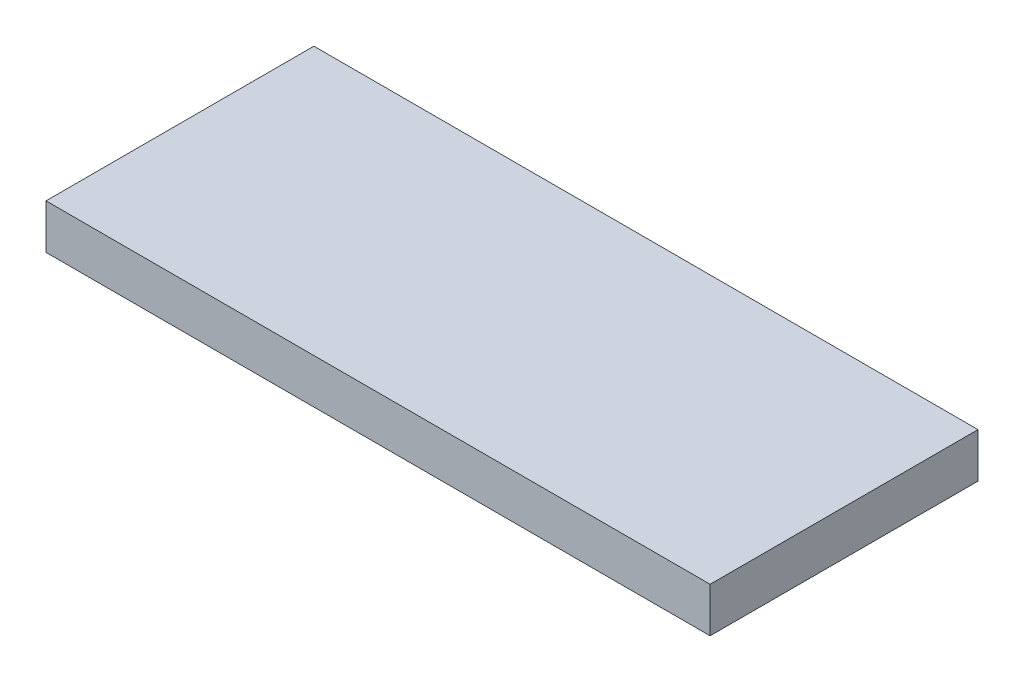
ISO-10303-21;
HEADER;
FILE_DESCRIPTION(('STEP AP214'),'2;1');
FILE_NAME('part.step','',(''),(''),'','','');
FILE_SCHEMA(('AUTOMOTIVE_DESIGN { 1 0 10303 214 1 1 1 1 }'));
ENDSEC;
DATA;
#1=APPLICATION_CONTEXT('core data for automotive mechanical design processes');
#2=APPLICATION_PROTOCOL_DEFINITION('international standard','automotive_design',2000,#1);
#3=PRODUCT_CONTEXT('',#1,'mechanical');
#4=PRODUCT('Part','Part','',(#3));
#5=PRODUCT_RELATED_PRODUCT_CATEGORY('part','',(#4));
#6=PRODUCT_DEFINITION_FORMATION('','',#4);
#7=PRODUCT_DEFINITION_CONTEXT('part definition',#1,'design');
#8=PRODUCT_DEFINITION('design','',#6,#7);
#9=PRODUCT_DEFINITION_SHAPE('','',#8);
#10=(LENGTH_UNIT() NAMED_UNIT(*) SI_UNIT(.MILLI.,.METRE.));
#11=(NAMED_UNIT(*) PLANE_ANGLE_UNIT() SI_UNIT($,.RADIAN.));
#12=(NAMED_UNIT(*) SI_UNIT($,.STERADIAN.) SOLID_ANGLE_UNIT());
#13=UNCERTAINTY_MEASURE_WITH_UNIT(LENGTH_MEASURE(1.E-05),#10,'distance_accuracy_value','');
#14=(GEOMETRIC_REPRESENTATION_CONTEXT(3) GLOBAL_UNCERTAINTY_ASSIGNED_CONTEXT((#13)) GLOBAL_UNIT_ASSIGNED_CONTEXT((#10,
#11,#12)) REPRESENTATION_CONTEXT('',''));
#15=CARTESIAN_POINT('',(0.,0.,0.));
#16=DIRECTION('',(0.,0.,1.));
#17=DIRECTION('',(1.,0.,0.));
#18=AXIS2_PLACEMENT_3D('',#15,#16,#17);
#19=CARTESIAN_POINT('',(0.,69.85,38.1));
#20=DIRECTION('',(0.,1.,0.));
#21=DIRECTION('',(0.,0.,1.));
#22=AXIS2_PLACEMENT_3D('',#19,#20,#21);
#23=PLANE('',#22);
#24=DIRECTION('',(1.,0.,0.));
#25=VECTOR('',#24,1.);
#26=CARTESIAN_POINT('',(0.,69.85,0.));
#27=LINE('',#26,#25);
#28=CARTESIAN_POINT('',(0.,69.85,0.));
#29=VERTEX_POINT('',#28);
#30=CARTESIAN_POINT('',(94.447991823564,69.85,0.));
#31=VERTEX_POINT('',#30);
#32=EDGE_CURVE('E56',#29,#31,#27,.T.);
#33=ORIENTED_EDGE('',*,*,#32,.T.);
#34=DIRECTION('',(0.,0.,-1.));
#35=VECTOR('',#34,1.);
#36=CARTESIAN_POINT('',(94.447991823564,69.85,38.1));
#37=LINE('',#36,#35);
#38=CARTESIAN_POINT('',(94.447991823564,69.85,38.1));
#39=VERTEX_POINT('',#38);
#40=EDGE_CURVE('E11',#39,#31,#37,.T.);
#41=ORIENTED_EDGE('',*,*,#40,.F.);
#42=DIRECTION('',(1.,0.,0.));
#43=VECTOR('',#42,1.);
#44=CARTESIAN_POINT('',(0.,69.85,38.1));
#45=LINE('',#44,#43);
#46=CARTESIAN_POINT('',(0.,69.85,38.1));
#47=VERTEX_POINT('',#46);
#48=EDGE_CURVE('E76',#47,#39,#45,.T.);
#49=ORIENTED_EDGE('',*,*,#48,.F.);
#50=DIRECTION('',(0.,0.,-1.));
#51=VECTOR('',#50,1.);
#52=CARTESIAN_POINT('',(0.,69.85,38.1));
#53=LINE('',#52,#51);
#54=EDGE_CURVE('E78',#47,#29,#53,.T.);
#55=ORIENTED_EDGE('',*,*,#54,.T.);
#56=EDGE_LOOP('',(#33,#41,#49,#55));
#57=FACE_BOUND('',#56,.T.);
#58=ADVANCED_FACE('F37',(#57),#23,.F.);
#59=CARTESIAN_POINT('',(94.447991823564,0.,38.1));
#60=DIRECTION('',(1.,0.,0.));
#61=DIRECTION('',(0.,0.,-1.));
#62=AXIS2_PLACEMENT_3D('',#59,#60,#61);
#63=PLANE('',#62);
#64=DIRECTION('',(0.,0.,-1.));
#65=VECTOR('',#64,1.);
#66=CARTESIAN_POINT('',(94.447991823564,76.2,38.1));
#67=LINE('',#66,#65);
#68=CARTESIAN_POINT('',(94.447991823564,76.2,38.1));
#69=VERTEX_POINT('',#68);
#70=CARTESIAN_POINT('',(94.447991823564,76.2,0.));
#71=VERTEX_POINT('',#70);
#72=EDGE_CURVE('E91',#69,#71,#67,.T.);
#73=ORIENTED_EDGE('',*,*,#72,.F.);
#74=DIRECTION('',(0.,-1.,0.));
#75=VECTOR('',#74,1.);
#76=CARTESIAN_POINT('',(94.447991823564,0.,38.1));
#77=LINE('',#76,#75);
#78=EDGE_CURVE('E83',#69,#39,#77,.T.);
#79=ORIENTED_EDGE('',*,*,#78,.T.);
#80=ORIENTED_EDGE('',*,*,#40,.T.);
#81=DIRECTION('',(0.,-1.,0.));
#82=VECTOR('',#81,1.);
#83=CARTESIAN_POINT('',(94.447991823564,0.,0.));
#84=LINE('',#83,#82);
#85=EDGE_CURVE('E101',#71,#31,#84,.T.);
#86=ORIENTED_EDGE('',*,*,#85,.F.);
#87=EDGE_LOOP('',(#73,#79,#80,#86));
#88=FACE_BOUND('',#87,.T.);
#89=ADVANCED_FACE('F111',(#88),#63,.T.);
#90=CARTESIAN_POINT('',(0.,76.2,38.1));
#91=DIRECTION('',(0.,1.,0.));
#92=DIRECTION('',(0.,0.,1.));
#93=AXIS2_PLACEMENT_3D('',#90,#91,#92);
#94=PLANE('',#93);
#95=DIRECTION('',(1.,0.,0.));
#96=VECTOR('',#95,1.);
#97=CARTESIAN_POINT('',(0.,76.2,0.));
#98=LINE('',#97,#96);
#99=CARTESIAN_POINT('',(0.,76.2,0.));
#100=VERTEX_POINT('',#99);
#101=EDGE_CURVE('E51',#100,#71,#98,.T.);
#102=ORIENTED_EDGE('',*,*,#101,.F.);
#103=DIRECTION('',(0.,0.,-1.));
#104=VECTOR('',#103,1.);
#105=CARTESIAN_POINT('',(0.,76.2,38.1));
#106=LINE('',#105,#104);
#107=CARTESIAN_POINT('',(0.,76.2,38.1));
#108=VERTEX_POINT('',#107);
#109=EDGE_CURVE('E44',#108,#100,#106,.T.);
#110=ORIENTED_EDGE('',*,*,#109,.F.);
#111=DIRECTION('',(1.,0.,0.));
#112=VECTOR('',#111,1.);
#113=CARTESIAN_POINT('',(0.,76.2,38.1));
#114=LINE('',#113,#112);
#115=EDGE_CURVE('E95',#108,#69,#114,.T.);
#116=ORIENTED_EDGE('',*,*,#115,.T.);
#117=ORIENTED_EDGE('',*,*,#72,.T.);
#118=EDGE_LOOP('',(#102,#110,#116,#117));
#119=FACE_BOUND('',#118,.T.);
#120=ADVANCED_FACE('F106',(#119),#94,.T.);
#121=CARTESIAN_POINT('',(0.,0.,38.1));
#122=DIRECTION('',(-1.,0.,0.));
#123=DIRECTION('',(0.,0.,1.));
#124=AXIS2_PLACEMENT_3D('',#121,#122,#123);
#125=PLANE('',#124);
#126=ORIENTED_EDGE('',*,*,#54,.F.);
#127=DIRECTION('',(0.,1.,0.));
#128=VECTOR('',#127,1.);
#129=CARTESIAN_POINT('',(0.,0.,38.1));
#130=LINE('',#129,#128);
#131=EDGE_CURVE('E89',#47,#108,#130,.T.);
#132=ORIENTED_EDGE('',*,*,#131,.T.);
#133=ORIENTED_EDGE('',*,*,#109,.T.);
#134=DIRECTION('',(0.,1.,0.));
#135=VECTOR('',#134,1.);
#136=CARTESIAN_POINT('',(0.,0.,0.));
#137=LINE('',#136,#135);
#138=EDGE_CURVE('E84',#29,#100,#137,.T.);
#139=ORIENTED_EDGE('',*,*,#138,.F.);
#140=EDGE_LOOP('',(#126,#132,#133,#139));
#141=FACE_BOUND('',#140,.T.);
#142=ADVANCED_FACE('F87',(#141),#125,.T.);
#143=CARTESIAN_POINT('',(0.,0.,38.1));
#144=DIRECTION('',(0.,0.,1.));
#145=DIRECTION('',(1.,0.,0.));
#146=AXIS2_PLACEMENT_3D('',#143,#144,#145);
#147=PLANE('',#146);
#148=ORIENTED_EDGE('',*,*,#78,.F.);
#149=ORIENTED_EDGE('',*,*,#115,.F.);
#150=ORIENTED_EDGE('',*,*,#131,.F.);
#151=ORIENTED_EDGE('',*,*,#48,.T.);
#152=EDGE_LOOP('',(#148,#149,#150,#151));
#153=FACE_BOUND('',#152,.T.);
#154=ADVANCED_FACE('F94',(#153),#147,.T.);
#155=CARTESIAN_POINT('',(0.,0.,0.));
#156=DIRECTION('',(0.,0.,1.));
#157=DIRECTION('',(1.,0.,0.));
#158=AXIS2_PLACEMENT_3D('',#155,#156,#157);
#159=PLANE('',#158);
#160=ORIENTED_EDGE('',*,*,#101,.T.);
#161=ORIENTED_EDGE('',*,*,#85,.T.);
#162=ORIENTED_EDGE('',*,*,#32,.F.);
#163=ORIENTED_EDGE('',*,*,#138,.T.);
#164=EDGE_LOOP('',(#160,#161,#162,#163));
#165=FACE_BOUND('',#164,.T.);
#166=ADVANCED_FACE('F104',(#165),#159,.F.);
#167=CLOSED_SHELL('',(#58,#89,#120,#142,#154,#166));
#168=MANIFOLD_SOLID_BREP('B2',#167);
#169=ADVANCED_BREP_SHAPE_REPRESENTATION('',(#18,#168),#14);
#170=SHAPE_DEFINITION_REPRESENTATION(#9,#169);
ENDSEC;
END-ISO-10303-21;
